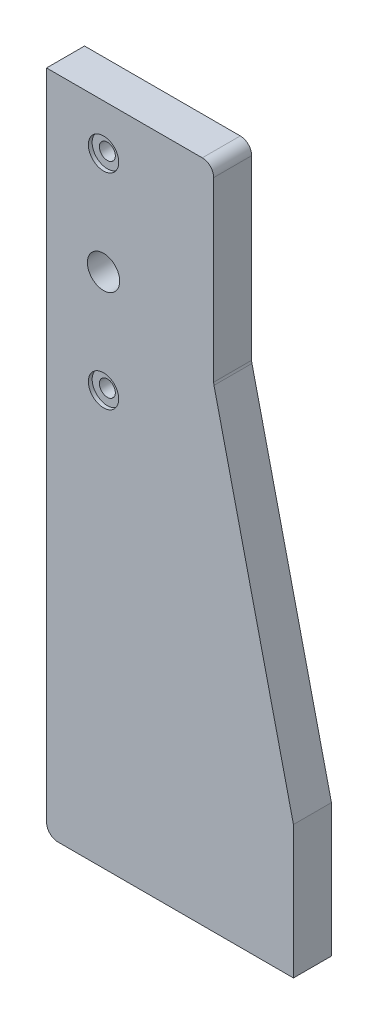
ISO-10303-21;
HEADER;
FILE_DESCRIPTION(('STEP AP214'),'2;1');
FILE_NAME('part.step','',(''),(''),'','','');
FILE_SCHEMA(('AUTOMOTIVE_DESIGN { 1 0 10303 214 1 1 1 1 }'));
ENDSEC;
DATA;
#1=APPLICATION_CONTEXT('core data for automotive mechanical design processes');
#2=APPLICATION_PROTOCOL_DEFINITION('international standard','automotive_design',2000,#1);
#3=PRODUCT_CONTEXT('',#1,'mechanical');
#4=PRODUCT('Part','Part','',(#3));
#5=PRODUCT_RELATED_PRODUCT_CATEGORY('part','',(#4));
#6=PRODUCT_DEFINITION_FORMATION('','',#4);
#7=PRODUCT_DEFINITION_CONTEXT('part definition',#1,'design');
#8=PRODUCT_DEFINITION('design','',#6,#7);
#9=PRODUCT_DEFINITION_SHAPE('','',#8);
#10=(LENGTH_UNIT() NAMED_UNIT(*) SI_UNIT(.MILLI.,.METRE.));
#11=(NAMED_UNIT(*) PLANE_ANGLE_UNIT() SI_UNIT($,.RADIAN.));
#12=(NAMED_UNIT(*) SI_UNIT($,.STERADIAN.) SOLID_ANGLE_UNIT());
#13=UNCERTAINTY_MEASURE_WITH_UNIT(LENGTH_MEASURE(1.E-05),#10,'distance_accuracy_value','');
#14=(GEOMETRIC_REPRESENTATION_CONTEXT(3) GLOBAL_UNCERTAINTY_ASSIGNED_CONTEXT((#13)) GLOBAL_UNIT_ASSIGNED_CONTEXT((#10,
#11,#12)) REPRESENTATION_CONTEXT('',''));
#15=CARTESIAN_POINT('',(0.,0.,0.));
#16=DIRECTION('',(0.,0.,1.));
#17=DIRECTION('',(1.,0.,0.));
#18=AXIS2_PLACEMENT_3D('',#15,#16,#17);
#19=CARTESIAN_POINT('',(15.,109.,0.));
#20=DIRECTION('',(0.,0.,1.));
#21=DIRECTION('',(1.,0.,0.));
#22=AXIS2_PLACEMENT_3D('',#19,#20,#21);
#23=CYLINDRICAL_SURFACE('',#22,2.1);
#24=CARTESIAN_POINT('',(15.,109.,0.));
#25=DIRECTION('',(0.,0.,1.));
#26=DIRECTION('',(1.,0.,0.));
#27=AXIS2_PLACEMENT_3D('',#24,#25,#26);
#28=CIRCLE('',#27,2.1);
#29=CARTESIAN_POINT('',(17.1,109.,0.));
#30=VERTEX_POINT('',#29);
#31=EDGE_CURVE('E191',#30,#30,#28,.T.);
#32=ORIENTED_EDGE('',*,*,#31,.F.);
#33=EDGE_LOOP('',(#32));
#34=FACE_BOUND('',#33,.T.);
#35=CARTESIAN_POINT('',(15.,109.,9.));
#36=DIRECTION('',(0.,0.,1.));
#37=DIRECTION('',(1.,0.,0.));
#38=AXIS2_PLACEMENT_3D('',#35,#36,#37);
#39=CIRCLE('',#38,2.1);
#40=CARTESIAN_POINT('',(17.1,109.,9.));
#41=VERTEX_POINT('',#40);
#42=EDGE_CURVE('E145',#41,#41,#39,.F.);
#43=ORIENTED_EDGE('',*,*,#42,.F.);
#44=EDGE_LOOP('',(#43));
#45=FACE_BOUND('',#44,.T.);
#46=ADVANCED_FACE('F34',(#34,#45),#23,.F.);
#47=CARTESIAN_POINT('',(15.,163.,0.));
#48=DIRECTION('',(0.,0.,1.));
#49=DIRECTION('',(1.,0.,0.));
#50=AXIS2_PLACEMENT_3D('',#47,#48,#49);
#51=CYLINDRICAL_SURFACE('',#50,2.09999999999999);
#52=CARTESIAN_POINT('',(15.,163.,0.));
#53=DIRECTION('',(0.,0.,1.));
#54=DIRECTION('',(1.,0.,0.));
#55=AXIS2_PLACEMENT_3D('',#52,#53,#54);
#56=CIRCLE('',#55,2.09999999999999);
#57=CARTESIAN_POINT('',(17.1,163.,0.));
#58=VERTEX_POINT('',#57);
#59=EDGE_CURVE('E143',#58,#58,#56,.T.);
#60=ORIENTED_EDGE('',*,*,#59,.F.);
#61=EDGE_LOOP('',(#60));
#62=FACE_BOUND('',#61,.T.);
#63=CARTESIAN_POINT('',(15.,163.,9.));
#64=DIRECTION('',(0.,0.,1.));
#65=DIRECTION('',(1.,0.,0.));
#66=AXIS2_PLACEMENT_3D('',#63,#64,#65);
#67=CIRCLE('',#66,2.09999999999999);
#68=CARTESIAN_POINT('',(17.1,163.,9.));
#69=VERTEX_POINT('',#68);
#70=EDGE_CURVE('E140',#69,#69,#67,.F.);
#71=ORIENTED_EDGE('',*,*,#70,.F.);
#72=EDGE_LOOP('',(#71));
#73=FACE_BOUND('',#72,.T.);
#74=ADVANCED_FACE('F220',(#62,#73),#51,.F.);
#75=CARTESIAN_POINT('',(65.,0.,10.));
#76=DIRECTION('',(0.,1.,0.));
#77=DIRECTION('',(0.,0.,1.));
#78=AXIS2_PLACEMENT_3D('',#75,#76,#77);
#79=PLANE('',#78);
#80=DIRECTION('',(1.,0.,0.));
#81=VECTOR('',#80,1.);
#82=CARTESIAN_POINT('',(65.,0.,10.));
#83=LINE('',#82,#81);
#84=CARTESIAN_POINT('',(3.,0.,10.));
#85=VERTEX_POINT('',#84);
#86=CARTESIAN_POINT('',(65.,0.,10.));
#87=VERTEX_POINT('',#86);
#88=EDGE_CURVE('E104',#85,#87,#83,.T.);
#89=ORIENTED_EDGE('',*,*,#88,.F.);
#90=DIRECTION('',(0.,0.,-1.));
#91=VECTOR('',#90,1.);
#92=CARTESIAN_POINT('',(3.,0.,10.));
#93=LINE('',#92,#91);
#94=CARTESIAN_POINT('',(3.,0.,0.));
#95=VERTEX_POINT('',#94);
#96=EDGE_CURVE('E132',#85,#95,#93,.T.);
#97=ORIENTED_EDGE('',*,*,#96,.T.);
#98=DIRECTION('',(1.,0.,0.));
#99=VECTOR('',#98,1.);
#100=CARTESIAN_POINT('',(65.,0.,0.));
#101=LINE('',#100,#99);
#102=CARTESIAN_POINT('',(65.,0.,0.));
#103=VERTEX_POINT('',#102);
#104=EDGE_CURVE('E130',#95,#103,#101,.T.);
#105=ORIENTED_EDGE('',*,*,#104,.T.);
#106=DIRECTION('',(0.,0.,-1.));
#107=VECTOR('',#106,1.);
#108=CARTESIAN_POINT('',(65.,0.,10.));
#109=LINE('',#108,#107);
#110=EDGE_CURVE('E122',#87,#103,#109,.T.);
#111=ORIENTED_EDGE('',*,*,#110,.F.);
#112=EDGE_LOOP('',(#89,#97,#105,#111));
#113=FACE_BOUND('',#112,.T.);
#114=ADVANCED_FACE('F128',(#113),#79,.F.);
#115=CARTESIAN_POINT('',(65.,35.,10.));
#116=DIRECTION('',(-1.,0.,0.));
#117=DIRECTION('',(0.,0.,1.));
#118=AXIS2_PLACEMENT_3D('',#115,#116,#117);
#119=PLANE('',#118);
#120=DIRECTION('',(0.,1.,0.));
#121=VECTOR('',#120,1.);
#122=CARTESIAN_POINT('',(65.,35.,0.));
#123=LINE('',#122,#121);
#124=CARTESIAN_POINT('',(65.,35.,0.));
#125=VERTEX_POINT('',#124);
#126=EDGE_CURVE('E177',#103,#125,#123,.T.);
#127=ORIENTED_EDGE('',*,*,#126,.T.);
#128=DIRECTION('',(0.,0.,-1.));
#129=VECTOR('',#128,1.);
#130=CARTESIAN_POINT('',(65.,35.,10.));
#131=LINE('',#130,#129);
#132=CARTESIAN_POINT('',(65.,35.,10.));
#133=VERTEX_POINT('',#132);
#134=EDGE_CURVE('E124',#133,#125,#131,.T.);
#135=ORIENTED_EDGE('',*,*,#134,.F.);
#136=DIRECTION('',(0.,1.,0.));
#137=VECTOR('',#136,1.);
#138=CARTESIAN_POINT('',(65.,35.,10.));
#139=LINE('',#138,#137);
#140=EDGE_CURVE('E109',#87,#133,#139,.T.);
#141=ORIENTED_EDGE('',*,*,#140,.F.);
#142=ORIENTED_EDGE('',*,*,#110,.T.);
#143=EDGE_LOOP('',(#127,#135,#141,#142));
#144=FACE_BOUND('',#143,.T.);
#145=ADVANCED_FACE('F121',(#144),#119,.F.);
#146=CARTESIAN_POINT('',(44.,125.,10.));
#147=DIRECTION('',(-0.973841209741793,-0.227229615606419,0.));
#148=DIRECTION('',(0.227229615606419,-0.973841209741793,0.));
#149=AXIS2_PLACEMENT_3D('',#146,#147,#148);
#150=PLANE('',#149);
#151=DIRECTION('',(-0.227229615606419,0.973841209741793,0.));
#152=VECTOR('',#151,1.);
#153=CARTESIAN_POINT('',(44.,125.,0.));
#154=LINE('',#153,#152);
#155=CARTESIAN_POINT('',(44.0784763707746,124.66367269668,0.));
#156=VERTEX_POINT('',#155);
#157=EDGE_CURVE('E170',#125,#156,#154,.T.);
#158=ORIENTED_EDGE('',*,*,#157,.T.);
#159=DIRECTION('',(0.,0.,-1.));
#160=VECTOR('',#159,1.);
#161=CARTESIAN_POINT('',(44.0784763707746,124.66367269668,10.));
#162=LINE('',#161,#160);
#163=CARTESIAN_POINT('',(44.0784763707746,124.66367269668,10.));
#164=VERTEX_POINT('',#163);
#165=EDGE_CURVE('E161',#156,#164,#162,.F.);
#166=ORIENTED_EDGE('',*,*,#165,.T.);
#167=DIRECTION('',(-0.227229615606419,0.973841209741793,0.));
#168=VECTOR('',#167,1.);
#169=CARTESIAN_POINT('',(44.,125.,10.));
#170=LINE('',#169,#168);
#171=EDGE_CURVE('E126',#133,#164,#170,.T.);
#172=ORIENTED_EDGE('',*,*,#171,.F.);
#173=ORIENTED_EDGE('',*,*,#134,.T.);
#174=EDGE_LOOP('',(#158,#166,#172,#173));
#175=FACE_BOUND('',#174,.T.);
#176=ADVANCED_FACE('F176',(#175),#150,.F.);
#177=CARTESIAN_POINT('',(44.,175.,10.));
#178=DIRECTION('',(-1.,0.,0.));
#179=DIRECTION('',(0.,0.,1.));
#180=AXIS2_PLACEMENT_3D('',#177,#178,#179);
#181=PLANE('',#180);
#182=DIRECTION('',(0.,1.,0.));
#183=VECTOR('',#182,1.);
#184=CARTESIAN_POINT('',(44.,175.,10.));
#185=LINE('',#184,#183);
#186=CARTESIAN_POINT('',(44.,125.345361543499,10.));
#187=VERTEX_POINT('',#186);
#188=CARTESIAN_POINT('',(44.,172.,10.));
#189=VERTEX_POINT('',#188);
#190=EDGE_CURVE('E181',#187,#189,#185,.T.);
#191=ORIENTED_EDGE('',*,*,#190,.F.);
#192=DIRECTION('',(0.,0.,-1.));
#193=VECTOR('',#192,1.);
#194=CARTESIAN_POINT('',(44.,125.345361543499,0.));
#195=LINE('',#194,#193);
#196=CARTESIAN_POINT('',(44.,125.345361543499,0.));
#197=VERTEX_POINT('',#196);
#198=EDGE_CURVE('E158',#187,#197,#195,.T.);
#199=ORIENTED_EDGE('',*,*,#198,.T.);
#200=DIRECTION('',(0.,1.,0.));
#201=VECTOR('',#200,1.);
#202=CARTESIAN_POINT('',(44.,175.,0.));
#203=LINE('',#202,#201);
#204=CARTESIAN_POINT('',(44.,172.,0.));
#205=VERTEX_POINT('',#204);
#206=EDGE_CURVE('E171',#197,#205,#203,.T.);
#207=ORIENTED_EDGE('',*,*,#206,.T.);
#208=DIRECTION('',(0.,0.,-1.));
#209=VECTOR('',#208,1.);
#210=CARTESIAN_POINT('',(44.,172.,10.));
#211=LINE('',#210,#209);
#212=EDGE_CURVE('E57',#205,#189,#211,.F.);
#213=ORIENTED_EDGE('',*,*,#212,.T.);
#214=EDGE_LOOP('',(#191,#199,#207,#213));
#215=FACE_BOUND('',#214,.T.);
#216=ADVANCED_FACE('F182',(#215),#181,.F.);
#217=CARTESIAN_POINT('',(0.,175.,10.));
#218=DIRECTION('',(0.,-1.,0.));
#219=DIRECTION('',(0.,0.,-1.));
#220=AXIS2_PLACEMENT_3D('',#217,#218,#219);
#221=PLANE('',#220);
#222=DIRECTION('',(-1.,0.,0.));
#223=VECTOR('',#222,1.);
#224=CARTESIAN_POINT('',(0.,175.,10.));
#225=LINE('',#224,#223);
#226=CARTESIAN_POINT('',(41.,175.,10.));
#227=VERTEX_POINT('',#226);
#228=CARTESIAN_POINT('',(0.,175.,10.));
#229=VERTEX_POINT('',#228);
#230=EDGE_CURVE('E183',#227,#229,#225,.T.);
#231=ORIENTED_EDGE('',*,*,#230,.F.);
#232=DIRECTION('',(0.,0.,-1.));
#233=VECTOR('',#232,1.);
#234=CARTESIAN_POINT('',(41.,175.,10.));
#235=LINE('',#234,#233);
#236=CARTESIAN_POINT('',(41.,175.,0.));
#237=VERTEX_POINT('',#236);
#238=EDGE_CURVE('E163',#227,#237,#235,.T.);
#239=ORIENTED_EDGE('',*,*,#238,.T.);
#240=DIRECTION('',(-1.,0.,0.));
#241=VECTOR('',#240,1.);
#242=CARTESIAN_POINT('',(0.,175.,0.));
#243=LINE('',#242,#241);
#244=CARTESIAN_POINT('',(0.,175.,0.));
#245=VERTEX_POINT('',#244);
#246=EDGE_CURVE('E194',#237,#245,#243,.T.);
#247=ORIENTED_EDGE('',*,*,#246,.T.);
#248=DIRECTION('',(0.,0.,-1.));
#249=VECTOR('',#248,1.);
#250=CARTESIAN_POINT('',(0.,175.,10.));
#251=LINE('',#250,#249);
#252=EDGE_CURVE('E136',#229,#245,#251,.T.);
#253=ORIENTED_EDGE('',*,*,#252,.F.);
#254=EDGE_LOOP('',(#231,#239,#247,#253));
#255=FACE_BOUND('',#254,.T.);
#256=ADVANCED_FACE('F209',(#255),#221,.F.);
#257=CARTESIAN_POINT('',(0.,0.,10.));
#258=DIRECTION('',(1.,0.,0.));
#259=DIRECTION('',(0.,0.,-1.));
#260=AXIS2_PLACEMENT_3D('',#257,#258,#259);
#261=PLANE('',#260);
#262=DIRECTION('',(0.,-1.,0.));
#263=VECTOR('',#262,1.);
#264=CARTESIAN_POINT('',(0.,0.,0.));
#265=LINE('',#264,#263);
#266=CARTESIAN_POINT('',(0.,3.,0.));
#267=VERTEX_POINT('',#266);
#268=EDGE_CURVE('E117',#245,#267,#265,.T.);
#269=ORIENTED_EDGE('',*,*,#268,.T.);
#270=DIRECTION('',(0.,0.,-1.));
#271=VECTOR('',#270,1.);
#272=CARTESIAN_POINT('',(0.,3.,10.));
#273=LINE('',#272,#271);
#274=CARTESIAN_POINT('',(0.,3.,10.));
#275=VERTEX_POINT('',#274);
#276=EDGE_CURVE('E153',#267,#275,#273,.F.);
#277=ORIENTED_EDGE('',*,*,#276,.T.);
#278=DIRECTION('',(0.,-1.,0.));
#279=VECTOR('',#278,1.);
#280=CARTESIAN_POINT('',(0.,0.,10.));
#281=LINE('',#280,#279);
#282=EDGE_CURVE('E185',#229,#275,#281,.T.);
#283=ORIENTED_EDGE('',*,*,#282,.F.);
#284=ORIENTED_EDGE('',*,*,#252,.T.);
#285=EDGE_LOOP('',(#269,#277,#283,#284));
#286=FACE_BOUND('',#285,.T.);
#287=ADVANCED_FACE('F202',(#286),#261,.F.);
#288=CARTESIAN_POINT('',(0.,0.,10.));
#289=DIRECTION('',(0.,0.,-1.));
#290=DIRECTION('',(-1.,0.,0.));
#291=AXIS2_PLACEMENT_3D('',#288,#289,#290);
#292=PLANE('',#291);
#293=CARTESIAN_POINT('',(15.,136.,10.));
#294=DIRECTION('',(0.,0.,1.));
#295=DIRECTION('',(1.,0.,0.));
#296=AXIS2_PLACEMENT_3D('',#293,#294,#295);
#297=CIRCLE('',#296,4.25);
#298=CARTESIAN_POINT('',(19.25,136.,10.));
#299=VERTEX_POINT('',#298);
#300=EDGE_CURVE('E299',#299,#299,#297,.T.);
#301=ORIENTED_EDGE('',*,*,#300,.F.);
#302=EDGE_LOOP('',(#301));
#303=FACE_BOUND('',#302,.T.);
#304=CARTESIAN_POINT('',(15.,109.,10.));
#305=DIRECTION('',(0.,0.,1.));
#306=DIRECTION('',(1.,0.,0.));
#307=AXIS2_PLACEMENT_3D('',#304,#305,#306);
#308=CIRCLE('',#307,4.);
#309=CARTESIAN_POINT('',(19.,109.,10.));
#310=VERTEX_POINT('',#309);
#311=EDGE_CURVE('E293',#310,#310,#308,.T.);
#312=ORIENTED_EDGE('',*,*,#311,.F.);
#313=EDGE_LOOP('',(#312));
#314=FACE_BOUND('',#313,.T.);
#315=CARTESIAN_POINT('',(15.,163.,10.));
#316=DIRECTION('',(0.,0.,1.));
#317=DIRECTION('',(1.,0.,0.));
#318=AXIS2_PLACEMENT_3D('',#315,#316,#317);
#319=CIRCLE('',#318,4.);
#320=CARTESIAN_POINT('',(19.,163.,10.));
#321=VERTEX_POINT('',#320);
#322=EDGE_CURVE('E147',#321,#321,#319,.T.);
#323=ORIENTED_EDGE('',*,*,#322,.F.);
#324=EDGE_LOOP('',(#323));
#325=FACE_BOUND('',#324,.T.);
#326=ORIENTED_EDGE('',*,*,#282,.T.);
#327=CARTESIAN_POINT('',(3.,3.,10.));
#328=DIRECTION('',(0.,0.,-1.));
#329=DIRECTION('',(-1.,0.,0.));
#330=AXIS2_PLACEMENT_3D('',#327,#328,#329);
#331=CIRCLE('',#330,3.);
#332=EDGE_CURVE('E112',#275,#85,#331,.F.);
#333=ORIENTED_EDGE('',*,*,#332,.T.);
#334=ORIENTED_EDGE('',*,*,#88,.T.);
#335=ORIENTED_EDGE('',*,*,#140,.T.);
#336=ORIENTED_EDGE('',*,*,#171,.T.);
#337=CARTESIAN_POINT('',(47.,125.345361543499,10.));
#338=DIRECTION('',(0.,0.,-1.));
#339=DIRECTION('',(-1.,0.,0.));
#340=AXIS2_PLACEMENT_3D('',#337,#338,#339);
#341=CIRCLE('',#340,3.);
#342=EDGE_CURVE('E11',#164,#187,#341,.T.);
#343=ORIENTED_EDGE('',*,*,#342,.T.);
#344=ORIENTED_EDGE('',*,*,#190,.T.);
#345=CARTESIAN_POINT('',(41.,172.,10.));
#346=DIRECTION('',(0.,0.,-1.));
#347=DIRECTION('',(-1.,0.,0.));
#348=AXIS2_PLACEMENT_3D('',#345,#346,#347);
#349=CIRCLE('',#348,3.);
#350=EDGE_CURVE('E49',#189,#227,#349,.F.);
#351=ORIENTED_EDGE('',*,*,#350,.T.);
#352=ORIENTED_EDGE('',*,*,#230,.T.);
#353=EDGE_LOOP('',(#326,#333,#334,#335,#336,#343,#344,#351,#352));
#354=FACE_BOUND('',#353,.T.);
#355=ADVANCED_FACE('F107',(#303,#314,#325,#354),#292,.F.);
#356=CARTESIAN_POINT('',(0.,0.,0.));
#357=DIRECTION('',(0.,0.,-1.));
#358=DIRECTION('',(-1.,0.,0.));
#359=AXIS2_PLACEMENT_3D('',#356,#357,#358);
#360=PLANE('',#359);
#361=CARTESIAN_POINT('',(15.,136.,0.));
#362=DIRECTION('',(0.,0.,1.));
#363=DIRECTION('',(1.,0.,0.));
#364=AXIS2_PLACEMENT_3D('',#361,#362,#363);
#365=CIRCLE('',#364,4.25);
#366=CARTESIAN_POINT('',(19.25,136.,0.));
#367=VERTEX_POINT('',#366);
#368=EDGE_CURVE('E296',#367,#367,#365,.T.);
#369=ORIENTED_EDGE('',*,*,#368,.T.);
#370=EDGE_LOOP('',(#369));
#371=FACE_BOUND('',#370,.T.);
#372=ORIENTED_EDGE('',*,*,#59,.T.);
#373=EDGE_LOOP('',(#372));
#374=FACE_BOUND('',#373,.T.);
#375=ORIENTED_EDGE('',*,*,#31,.T.);
#376=EDGE_LOOP('',(#375));
#377=FACE_BOUND('',#376,.T.);
#378=ORIENTED_EDGE('',*,*,#104,.F.);
#379=CARTESIAN_POINT('',(3.,3.,0.));
#380=DIRECTION('',(0.,0.,-1.));
#381=DIRECTION('',(-1.,0.,0.));
#382=AXIS2_PLACEMENT_3D('',#379,#380,#381);
#383=CIRCLE('',#382,3.);
#384=EDGE_CURVE('E151',#95,#267,#383,.T.);
#385=ORIENTED_EDGE('',*,*,#384,.T.);
#386=ORIENTED_EDGE('',*,*,#268,.F.);
#387=ORIENTED_EDGE('',*,*,#246,.F.);
#388=CARTESIAN_POINT('',(41.,172.,0.));
#389=DIRECTION('',(0.,0.,-1.));
#390=DIRECTION('',(-1.,0.,0.));
#391=AXIS2_PLACEMENT_3D('',#388,#389,#390);
#392=CIRCLE('',#391,3.);
#393=EDGE_CURVE('E134',#237,#205,#392,.T.);
#394=ORIENTED_EDGE('',*,*,#393,.T.);
#395=ORIENTED_EDGE('',*,*,#206,.F.);
#396=CARTESIAN_POINT('',(47.,125.345361543499,0.));
#397=DIRECTION('',(0.,0.,-1.));
#398=DIRECTION('',(-1.,0.,0.));
#399=AXIS2_PLACEMENT_3D('',#396,#397,#398);
#400=CIRCLE('',#399,3.);
#401=EDGE_CURVE('E42',#197,#156,#400,.F.);
#402=ORIENTED_EDGE('',*,*,#401,.T.);
#403=ORIENTED_EDGE('',*,*,#157,.F.);
#404=ORIENTED_EDGE('',*,*,#126,.F.);
#405=EDGE_LOOP('',(#378,#385,#386,#387,#394,#395,#402,#403,#404));
#406=FACE_BOUND('',#405,.T.);
#407=ADVANCED_FACE('F169',(#371,#374,#377,#406),#360,.T.);
#408=CARTESIAN_POINT('',(15.,163.,9.));
#409=DIRECTION('',(0.,0.,1.));
#410=DIRECTION('',(1.,0.,0.));
#411=AXIS2_PLACEMENT_3D('',#408,#409,#410);
#412=PLANE('',#411);
#413=CARTESIAN_POINT('',(15.,163.,9.));
#414=DIRECTION('',(0.,0.,1.));
#415=DIRECTION('',(1.,0.,0.));
#416=AXIS2_PLACEMENT_3D('',#413,#414,#415);
#417=CIRCLE('',#416,4.);
#418=CARTESIAN_POINT('',(19.,163.,9.));
#419=VERTEX_POINT('',#418);
#420=EDGE_CURVE('E144',#419,#419,#417,.T.);
#421=ORIENTED_EDGE('',*,*,#420,.T.);
#422=EDGE_LOOP('',(#421));
#423=FACE_BOUND('',#422,.T.);
#424=ORIENTED_EDGE('',*,*,#70,.T.);
#425=EDGE_LOOP('',(#424));
#426=FACE_BOUND('',#425,.T.);
#427=ADVANCED_FACE('F237',(#423,#426),#412,.T.);
#428=CARTESIAN_POINT('',(15.,163.,9.));
#429=DIRECTION('',(0.,0.,1.));
#430=DIRECTION('',(1.,0.,0.));
#431=AXIS2_PLACEMENT_3D('',#428,#429,#430);
#432=CYLINDRICAL_SURFACE('',#431,4.);
#433=ORIENTED_EDGE('',*,*,#420,.F.);
#434=EDGE_LOOP('',(#433));
#435=FACE_BOUND('',#434,.T.);
#436=ORIENTED_EDGE('',*,*,#322,.T.);
#437=EDGE_LOOP('',(#436));
#438=FACE_BOUND('',#437,.T.);
#439=ADVANCED_FACE('F262',(#435,#438),#432,.F.);
#440=CARTESIAN_POINT('',(15.,109.,9.));
#441=DIRECTION('',(0.,0.,1.));
#442=DIRECTION('',(1.,0.,0.));
#443=AXIS2_PLACEMENT_3D('',#440,#441,#442);
#444=PLANE('',#443);
#445=CARTESIAN_POINT('',(15.,109.,9.));
#446=DIRECTION('',(0.,0.,1.));
#447=DIRECTION('',(1.,0.,0.));
#448=AXIS2_PLACEMENT_3D('',#445,#446,#447);
#449=CIRCLE('',#448,4.);
#450=CARTESIAN_POINT('',(19.,109.,9.));
#451=VERTEX_POINT('',#450);
#452=EDGE_CURVE('E148',#451,#451,#449,.T.);
#453=ORIENTED_EDGE('',*,*,#452,.T.);
#454=EDGE_LOOP('',(#453));
#455=FACE_BOUND('',#454,.T.);
#456=ORIENTED_EDGE('',*,*,#42,.T.);
#457=EDGE_LOOP('',(#456));
#458=FACE_BOUND('',#457,.T.);
#459=ADVANCED_FACE('F256',(#455,#458),#444,.T.);
#460=CARTESIAN_POINT('',(15.,109.,9.));
#461=DIRECTION('',(0.,0.,1.));
#462=DIRECTION('',(1.,0.,0.));
#463=AXIS2_PLACEMENT_3D('',#460,#461,#462);
#464=CYLINDRICAL_SURFACE('',#463,4.);
#465=ORIENTED_EDGE('',*,*,#452,.F.);
#466=EDGE_LOOP('',(#465));
#467=FACE_BOUND('',#466,.T.);
#468=ORIENTED_EDGE('',*,*,#311,.T.);
#469=EDGE_LOOP('',(#468));
#470=FACE_BOUND('',#469,.T.);
#471=ADVANCED_FACE('F252',(#467,#470),#464,.F.);
#472=CARTESIAN_POINT('',(3.,3.,10.));
#473=DIRECTION('',(0.,0.,-1.));
#474=DIRECTION('',(-1.,0.,0.));
#475=AXIS2_PLACEMENT_3D('',#472,#473,#474);
#476=CYLINDRICAL_SURFACE('',#475,3.);
#477=ORIENTED_EDGE('',*,*,#332,.F.);
#478=ORIENTED_EDGE('',*,*,#276,.F.);
#479=ORIENTED_EDGE('',*,*,#384,.F.);
#480=ORIENTED_EDGE('',*,*,#96,.F.);
#481=EDGE_LOOP('',(#477,#478,#479,#480));
#482=FACE_BOUND('',#481,.T.);
#483=ADVANCED_FACE('F207',(#482),#476,.T.);
#484=CARTESIAN_POINT('',(47.,125.345361543499,10.));
#485=DIRECTION('',(0.,0.,1.));
#486=DIRECTION('',(1.,0.,0.));
#487=AXIS2_PLACEMENT_3D('',#484,#485,#486);
#488=CYLINDRICAL_SURFACE('',#487,3.);
#489=ORIENTED_EDGE('',*,*,#342,.F.);
#490=ORIENTED_EDGE('',*,*,#165,.F.);
#491=ORIENTED_EDGE('',*,*,#401,.F.);
#492=ORIENTED_EDGE('',*,*,#198,.F.);
#493=EDGE_LOOP('',(#489,#490,#491,#492));
#494=FACE_BOUND('',#493,.T.);
#495=ADVANCED_FACE('F180',(#494),#488,.F.);
#496=CARTESIAN_POINT('',(41.,172.,10.));
#497=DIRECTION('',(0.,0.,-1.));
#498=DIRECTION('',(-1.,0.,0.));
#499=AXIS2_PLACEMENT_3D('',#496,#497,#498);
#500=CYLINDRICAL_SURFACE('',#499,3.);
#501=ORIENTED_EDGE('',*,*,#350,.F.);
#502=ORIENTED_EDGE('',*,*,#212,.F.);
#503=ORIENTED_EDGE('',*,*,#393,.F.);
#504=ORIENTED_EDGE('',*,*,#238,.F.);
#505=EDGE_LOOP('',(#501,#502,#503,#504));
#506=FACE_BOUND('',#505,.T.);
#507=ADVANCED_FACE('F36',(#506),#500,.T.);
#508=CARTESIAN_POINT('',(15.,136.,0.));
#509=DIRECTION('',(0.,0.,1.));
#510=DIRECTION('',(1.,0.,0.));
#511=AXIS2_PLACEMENT_3D('',#508,#509,#510);
#512=CYLINDRICAL_SURFACE('',#511,4.25);
#513=ORIENTED_EDGE('',*,*,#368,.F.);
#514=EDGE_LOOP('',(#513));
#515=FACE_BOUND('',#514,.T.);
#516=ORIENTED_EDGE('',*,*,#300,.T.);
#517=EDGE_LOOP('',(#516));
#518=FACE_BOUND('',#517,.T.);
#519=ADVANCED_FACE('F212',(#515,#518),#512,.F.);
#520=CLOSED_SHELL('',(#46,#74,#114,#145,#176,#216,#256,#287,#355,#407,#427,#439,#459,#471,#483,
#495,#507,#519));
#521=MANIFOLD_SOLID_BREP('B2',#520);
#522=ADVANCED_BREP_SHAPE_REPRESENTATION('',(#18,#521),#14);
#523=SHAPE_DEFINITION_REPRESENTATION(#9,#522);
ENDSEC;
END-ISO-10303-21;
